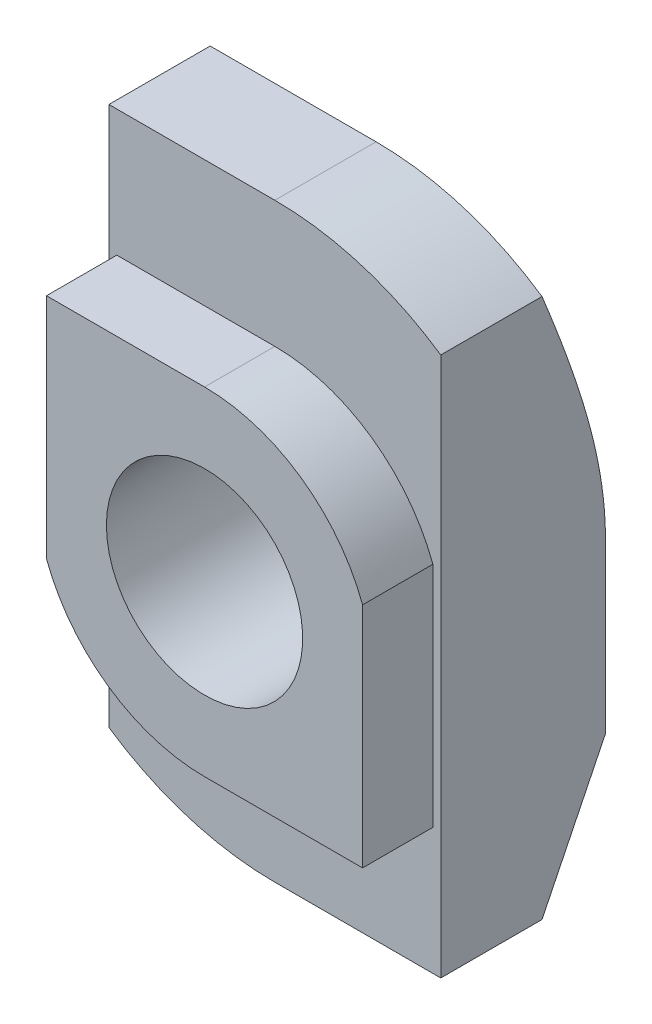
ISO-10303-21;
HEADER;
FILE_DESCRIPTION(('STEP AP214'),'2;1');
FILE_NAME('part.step','',(''),(''),'','','');
FILE_SCHEMA(('AUTOMOTIVE_DESIGN { 1 0 10303 214 1 1 1 1 }'));
ENDSEC;
DATA;
#1=APPLICATION_CONTEXT('core data for automotive mechanical design processes');
#2=APPLICATION_PROTOCOL_DEFINITION('international standard','automotive_design',2000,#1);
#3=PRODUCT_CONTEXT('',#1,'mechanical');
#4=PRODUCT('Part','Part','',(#3));
#5=PRODUCT_RELATED_PRODUCT_CATEGORY('part','',(#4));
#6=PRODUCT_DEFINITION_FORMATION('','',#4);
#7=PRODUCT_DEFINITION_CONTEXT('part definition',#1,'design');
#8=PRODUCT_DEFINITION('design','',#6,#7);
#9=PRODUCT_DEFINITION_SHAPE('','',#8);
#10=(LENGTH_UNIT() NAMED_UNIT(*) SI_UNIT(.MILLI.,.METRE.));
#11=(NAMED_UNIT(*) PLANE_ANGLE_UNIT() SI_UNIT($,.RADIAN.));
#12=(NAMED_UNIT(*) SI_UNIT($,.STERADIAN.) SOLID_ANGLE_UNIT());
#13=UNCERTAINTY_MEASURE_WITH_UNIT(LENGTH_MEASURE(1.E-05),#10,'distance_accuracy_value','');
#14=(GEOMETRIC_REPRESENTATION_CONTEXT(3) GLOBAL_UNCERTAINTY_ASSIGNED_CONTEXT((#13)) GLOBAL_UNIT_ASSIGNED_CONTEXT((#10,
#11,#12)) REPRESENTATION_CONTEXT('',''));
#15=CARTESIAN_POINT('',(0.,0.,0.));
#16=DIRECTION('',(0.,0.,1.));
#17=DIRECTION('',(1.,0.,0.));
#18=AXIS2_PLACEMENT_3D('',#15,#16,#17);
#19=CARTESIAN_POINT('',(-1.405,-0.52533322758036,4.4));
#20=DIRECTION('',(0.,0.,-1.));
#21=DIRECTION('',(-1.,0.,0.));
#22=AXIS2_PLACEMENT_3D('',#19,#20,#21);
#23=CYLINDRICAL_SURFACE('',#22,4.5);
#24=DIRECTION('',(0.,0.,-1.));
#25=VECTOR('',#24,1.);
#26=CARTESIAN_POINT('',(-5.62,-2.10133291032144,4.4));
#27=LINE('',#26,#25);
#28=CARTESIAN_POINT('',(-5.62,-2.10133291032144,4.4));
#29=VERTEX_POINT('',#28);
#30=CARTESIAN_POINT('',(-5.62,-2.10133291032144,2.525));
#31=VERTEX_POINT('',#30);
#32=EDGE_CURVE('E136',#29,#31,#27,.T.);
#33=ORIENTED_EDGE('',*,*,#32,.T.);
#34=CARTESIAN_POINT('',(-1.405,-0.52533322758036,2.525));
#35=DIRECTION('',(0.,0.,-1.));
#36=DIRECTION('',(-1.,0.,0.));
#37=AXIS2_PLACEMENT_3D('',#34,#35,#36);
#38=CIRCLE('',#37,4.5);
#39=CARTESIAN_POINT('',(-1.405,-5.02533322758036,2.525));
#40=VERTEX_POINT('',#39);
#41=EDGE_CURVE('E331',#31,#40,#38,.F.);
#42=ORIENTED_EDGE('',*,*,#41,.T.);
#43=DIRECTION('',(0.,0.,-1.));
#44=VECTOR('',#43,1.);
#45=CARTESIAN_POINT('',(-1.405,-5.02533322758036,4.4));
#46=LINE('',#45,#44);
#47=CARTESIAN_POINT('',(-1.405,-5.02533322758036,4.4));
#48=VERTEX_POINT('',#47);
#49=EDGE_CURVE('E202',#48,#40,#46,.T.);
#50=ORIENTED_EDGE('',*,*,#49,.F.);
#51=CARTESIAN_POINT('',(-1.405,-0.52533322758036,4.4));
#52=DIRECTION('',(0.,0.,1.));
#53=DIRECTION('',(-1.,0.,0.));
#54=AXIS2_PLACEMENT_3D('',#51,#52,#53);
#55=CIRCLE('',#54,4.5);
#56=EDGE_CURVE('E282',#29,#48,#55,.T.);
#57=ORIENTED_EDGE('',*,*,#56,.F.);
#58=EDGE_LOOP('',(#33,#42,#50,#57));
#59=FACE_BOUND('',#58,.T.);
#60=ADVANCED_FACE('F40',(#59),#23,.T.);
#61=CARTESIAN_POINT('',(-1.405,3.97466677241964,4.4));
#62=DIRECTION('',(0.,-1.,0.));
#63=DIRECTION('',(0.,0.,-1.));
#64=AXIS2_PLACEMENT_3D('',#61,#62,#63);
#65=PLANE('',#64);
#66=DIRECTION('',(1.,0.,0.));
#67=VECTOR('',#66,1.);
#68=CARTESIAN_POINT('',(-1.405,3.97466677241964,2.525));
#69=LINE('',#68,#67);
#70=CARTESIAN_POINT('',(-5.62,3.97466677241964,2.525));
#71=VERTEX_POINT('',#70);
#72=CARTESIAN_POINT('',(-1.405,3.97466677241964,2.525));
#73=VERTEX_POINT('',#72);
#74=EDGE_CURVE('E127',#71,#73,#69,.T.);
#75=ORIENTED_EDGE('',*,*,#74,.F.);
#76=DIRECTION('',(0.,0.,1.));
#77=VECTOR('',#76,1.);
#78=CARTESIAN_POINT('',(-5.62,3.97466677241964,4.4));
#79=LINE('',#78,#77);
#80=CARTESIAN_POINT('',(-5.62,3.97466677241964,4.4));
#81=VERTEX_POINT('',#80);
#82=EDGE_CURVE('E210',#71,#81,#79,.T.);
#83=ORIENTED_EDGE('',*,*,#82,.T.);
#84=DIRECTION('',(-1.,0.,0.));
#85=VECTOR('',#84,1.);
#86=CARTESIAN_POINT('',(-1.405,3.97466677241964,4.4));
#87=LINE('',#86,#85);
#88=CARTESIAN_POINT('',(-1.405,3.97466677241964,4.4));
#89=VERTEX_POINT('',#88);
#90=EDGE_CURVE('E248',#89,#81,#87,.T.);
#91=ORIENTED_EDGE('',*,*,#90,.F.);
#92=DIRECTION('',(0.,0.,-1.));
#93=VECTOR('',#92,1.);
#94=CARTESIAN_POINT('',(-1.405,3.97466677241964,4.4));
#95=LINE('',#94,#93);
#96=EDGE_CURVE('E215',#89,#73,#95,.T.);
#97=ORIENTED_EDGE('',*,*,#96,.T.);
#98=EDGE_LOOP('',(#75,#83,#91,#97));
#99=FACE_BOUND('',#98,.T.);
#100=ADVANCED_FACE('F289',(#99),#65,.F.);
#101=CARTESIAN_POINT('',(-1.405,-0.52533322758036,4.4));
#102=DIRECTION('',(0.,0.,-1.));
#103=DIRECTION('',(-1.,0.,0.));
#104=AXIS2_PLACEMENT_3D('',#101,#102,#103);
#105=CYLINDRICAL_SURFACE('',#104,4.5);
#106=DIRECTION('',(0.,0.,-1.));
#107=VECTOR('',#106,1.);
#108=CARTESIAN_POINT('',(2.81,1.05066645516072,4.4));
#109=LINE('',#108,#107);
#110=CARTESIAN_POINT('',(2.81,1.05066645516072,4.4));
#111=VERTEX_POINT('',#110);
#112=CARTESIAN_POINT('',(2.81,1.05066645516072,2.525));
#113=VERTEX_POINT('',#112);
#114=EDGE_CURVE('E208',#111,#113,#109,.T.);
#115=ORIENTED_EDGE('',*,*,#114,.T.);
#116=CARTESIAN_POINT('',(-1.405,-0.52533322758036,2.525));
#117=DIRECTION('',(0.,0.,-1.));
#118=DIRECTION('',(-1.,0.,0.));
#119=AXIS2_PLACEMENT_3D('',#116,#117,#118);
#120=CIRCLE('',#119,4.5);
#121=EDGE_CURVE('E241',#113,#73,#120,.F.);
#122=ORIENTED_EDGE('',*,*,#121,.T.);
#123=ORIENTED_EDGE('',*,*,#96,.F.);
#124=CARTESIAN_POINT('',(-1.405,-0.52533322758036,4.4));
#125=DIRECTION('',(0.,0.,1.));
#126=DIRECTION('',(-1.,0.,0.));
#127=AXIS2_PLACEMENT_3D('',#124,#125,#126);
#128=CIRCLE('',#127,4.5);
#129=EDGE_CURVE('E240',#111,#89,#128,.T.);
#130=ORIENTED_EDGE('',*,*,#129,.F.);
#131=EDGE_LOOP('',(#115,#122,#123,#130));
#132=FACE_BOUND('',#131,.T.);
#133=ADVANCED_FACE('F374',(#132),#105,.T.);
#134=CARTESIAN_POINT('',(-1.405,-5.02533322758036,4.4));
#135=DIRECTION('',(0.,1.,0.));
#136=DIRECTION('',(1.,0.,0.));
#137=AXIS2_PLACEMENT_3D('',#134,#135,#136);
#138=PLANE('',#137);
#139=DIRECTION('',(-1.,0.,0.));
#140=VECTOR('',#139,1.);
#141=CARTESIAN_POINT('',(-1.405,-5.02533322758036,2.525));
#142=LINE('',#141,#140);
#143=CARTESIAN_POINT('',(2.81,-5.02533322758036,2.525));
#144=VERTEX_POINT('',#143);
#145=EDGE_CURVE('E328',#144,#40,#142,.T.);
#146=ORIENTED_EDGE('',*,*,#145,.F.);
#147=DIRECTION('',(0.,0.,1.));
#148=VECTOR('',#147,1.);
#149=CARTESIAN_POINT('',(2.81,-5.02533322758036,4.4));
#150=LINE('',#149,#148);
#151=CARTESIAN_POINT('',(2.81,-5.02533322758036,4.4));
#152=VERTEX_POINT('',#151);
#153=EDGE_CURVE('E182',#144,#152,#150,.T.);
#154=ORIENTED_EDGE('',*,*,#153,.T.);
#155=DIRECTION('',(1.,0.,0.));
#156=VECTOR('',#155,1.);
#157=CARTESIAN_POINT('',(-1.405,-5.02533322758036,4.4));
#158=LINE('',#157,#156);
#159=EDGE_CURVE('E207',#48,#152,#158,.T.);
#160=ORIENTED_EDGE('',*,*,#159,.F.);
#161=ORIENTED_EDGE('',*,*,#49,.T.);
#162=EDGE_LOOP('',(#146,#154,#160,#161));
#163=FACE_BOUND('',#162,.T.);
#164=ADVANCED_FACE('F383',(#163),#138,.F.);
#165=CARTESIAN_POINT('',(-5.83,-8.40033322758036,-2.2));
#166=DIRECTION('',(0.,-1.,0.));
#167=DIRECTION('',(0.,0.,-1.));
#168=AXIS2_PLACEMENT_3D('',#165,#166,#167);
#169=PLANE('',#168);
#170=DIRECTION('',(-1.,0.,0.));
#171=VECTOR('',#170,1.);
#172=CARTESIAN_POINT('',(3.02,-8.40033322758036,2.525));
#173=LINE('',#172,#171);
#174=CARTESIAN_POINT('',(3.02,-8.40033322758036,2.525));
#175=VERTEX_POINT('',#174);
#176=CARTESIAN_POINT('',(-1.405,-8.40033322758036,2.525));
#177=VERTEX_POINT('',#176);
#178=EDGE_CURVE('E309',#175,#177,#173,.T.);
#179=ORIENTED_EDGE('',*,*,#178,.T.);
#180=DIRECTION('',(0.,0.,1.));
#181=VECTOR('',#180,1.);
#182=CARTESIAN_POINT('',(-1.405,-8.40033322758036,1.175));
#183=LINE('',#182,#181);
#184=CARTESIAN_POINT('',(-1.405,-8.40033322758036,-0.175));
#185=VERTEX_POINT('',#184);
#186=EDGE_CURVE('E50',#185,#177,#183,.T.);
#187=ORIENTED_EDGE('',*,*,#186,.F.);
#188=DIRECTION('',(-1.,0.,0.));
#189=VECTOR('',#188,1.);
#190=CARTESIAN_POINT('',(-3.6175,-8.40033322758036,-0.175));
#191=LINE('',#190,#189);
#192=CARTESIAN_POINT('',(3.02,-8.40033322758036,-0.175));
#193=VERTEX_POINT('',#192);
#194=EDGE_CURVE('E11',#193,#185,#191,.T.);
#195=ORIENTED_EDGE('',*,*,#194,.F.);
#196=DIRECTION('',(0.,0.,1.));
#197=VECTOR('',#196,1.);
#198=CARTESIAN_POINT('',(3.02,-8.40033322758036,-2.2));
#199=LINE('',#198,#197);
#200=EDGE_CURVE('E232',#193,#175,#199,.T.);
#201=ORIENTED_EDGE('',*,*,#200,.T.);
#202=EDGE_LOOP('',(#179,#187,#195,#201));
#203=FACE_BOUND('',#202,.T.);
#204=ADVANCED_FACE('F308',(#203),#169,.T.);
#205=CARTESIAN_POINT('',(-3.6175,-6.33783322758036,-1.1875));
#206=DIRECTION('',(0.,-0.440673190639415,-0.89766761056177));
#207=DIRECTION('',(0.,-0.89766761056177,0.440673190639415));
#208=AXIS2_PLACEMENT_3D('',#205,#206,#207);
#209=PLANE('',#208);
#210=DIRECTION('',(0.668005245131528,-0.668005245131529,0.327929847610023));
#211=VECTOR('',#210,1.);
#212=CARTESIAN_POINT('',(0.93596197816787,-2.86629520574823,-2.89170957435395));
#213=LINE('',#212,#211);
#214=CARTESIAN_POINT('',(2.34500000252043,-4.27533323012221,-2.19999999939639));
#215=VERTEX_POINT('',#214);
#216=CARTESIAN_POINT('',(3.02,-4.95033322758036,-1.86863636363636));
#217=VERTEX_POINT('',#216);
#218=EDGE_CURVE('E211',#215,#217,#213,.T.);
#219=ORIENTED_EDGE('',*,*,#218,.T.);
#220=DIRECTION('',(0.,-0.89766761056177,0.440673190639415));
#221=VECTOR('',#220,1.);
#222=CARTESIAN_POINT('',(3.02,-6.96856045187445,-0.877870271710176));
#223=LINE('',#222,#221);
#224=EDGE_CURVE('E226',#217,#193,#223,.T.);
#225=ORIENTED_EDGE('',*,*,#224,.T.);
#226=ORIENTED_EDGE('',*,*,#194,.T.);
#227=DIRECTION('',(0.,-0.89766761056177,0.440673190639415));
#228=VECTOR('',#227,1.);
#229=CARTESIAN_POINT('',(-1.405,-6.33783324216942,-1.18749999283809));
#230=LINE('',#229,#228);
#231=CARTESIAN_POINT('',(-1.405,-4.27533322822308,-2.19999999968448));
#232=VERTEX_POINT('',#231);
#233=EDGE_CURVE('E171',#232,#185,#230,.T.);
#234=ORIENTED_EDGE('',*,*,#233,.F.);
#235=DIRECTION('',(1.,0.,0.));
#236=VECTOR('',#235,1.);
#237=CARTESIAN_POINT('',(-3.6175,-4.27533322758036,-2.2));
#238=LINE('',#237,#236);
#239=EDGE_CURVE('E206',#232,#215,#238,.T.);
#240=ORIENTED_EDGE('',*,*,#239,.T.);
#241=EDGE_LOOP('',(#219,#225,#226,#234,#240));
#242=FACE_BOUND('',#241,.T.);
#243=ADVANCED_FACE('F343',(#242),#209,.T.);
#244=CARTESIAN_POINT('',(0.8075,5.28716677241964,-1.1875));
#245=DIRECTION('',(0.,0.440673190639415,-0.89766761056177));
#246=DIRECTION('',(-1.,0.,0.));
#247=AXIS2_PLACEMENT_3D('',#244,#245,#246);
#248=PLANE('',#247);
#249=DIRECTION('',(-0.668005245131529,0.668005245131529,0.327929847610023));
#250=VECTOR('',#249,1.);
#251=CARTESIAN_POINT('',(-3.74596197816787,1.81562875058751,-2.89170957435395));
#252=LINE('',#251,#250);
#253=CARTESIAN_POINT('',(-5.15500000252043,3.22466677496149,-2.19999999939639));
#254=VERTEX_POINT('',#253);
#255=CARTESIAN_POINT('',(-5.83,3.89966677241964,-1.86863636363636));
#256=VERTEX_POINT('',#255);
#257=EDGE_CURVE('E225',#254,#256,#252,.T.);
#258=ORIENTED_EDGE('',*,*,#257,.T.);
#259=DIRECTION('',(0.,0.89766761056177,0.440673190639415));
#260=VECTOR('',#259,1.);
#261=CARTESIAN_POINT('',(-5.83,5.91789399671373,-0.877870271710176));
#262=LINE('',#261,#260);
#263=CARTESIAN_POINT('',(-5.83,7.34966677241964,-0.175));
#264=VERTEX_POINT('',#263);
#265=EDGE_CURVE('E188',#256,#264,#262,.T.);
#266=ORIENTED_EDGE('',*,*,#265,.T.);
#267=DIRECTION('',(1.,0.,0.));
#268=VECTOR('',#267,1.);
#269=CARTESIAN_POINT('',(0.8075,7.34966677241964,-0.175));
#270=LINE('',#269,#268);
#271=CARTESIAN_POINT('',(-1.405,7.34966677241964,-0.175));
#272=VERTEX_POINT('',#271);
#273=EDGE_CURVE('E185',#264,#272,#270,.T.);
#274=ORIENTED_EDGE('',*,*,#273,.T.);
#275=DIRECTION('',(0.,0.89766761056177,0.440673190639415));
#276=VECTOR('',#275,1.);
#277=CARTESIAN_POINT('',(-1.405,5.2871667870087,-1.18749999283809));
#278=LINE('',#277,#276);
#279=CARTESIAN_POINT('',(-1.405,3.22466677306236,-2.19999999968448));
#280=VERTEX_POINT('',#279);
#281=EDGE_CURVE('E160',#280,#272,#278,.T.);
#282=ORIENTED_EDGE('',*,*,#281,.F.);
#283=DIRECTION('',(-1.,0.,0.));
#284=VECTOR('',#283,1.);
#285=CARTESIAN_POINT('',(0.8075,3.22466677241964,-2.2));
#286=LINE('',#285,#284);
#287=EDGE_CURVE('E245',#280,#254,#286,.T.);
#288=ORIENTED_EDGE('',*,*,#287,.T.);
#289=EDGE_LOOP('',(#258,#266,#274,#282,#288));
#290=FACE_BOUND('',#289,.T.);
#291=ADVANCED_FACE('F186',(#290),#248,.T.);
#292=CARTESIAN_POINT('',(-1.405,-0.52533322758036,1.175));
#293=DIRECTION('',(0.,0.,-1.));
#294=DIRECTION('',(0.,-1.,0.));
#295=AXIS2_PLACEMENT_3D('',#292,#293,#294);
#296=CYLINDRICAL_SURFACE('',#295,7.875);
#297=CARTESIAN_POINT('',(-1.405,-0.525333227580361,2.525));
#298=DIRECTION('',(0.,0.,-1.));
#299=DIRECTION('',(-1.,0.,0.));
#300=AXIS2_PLACEMENT_3D('',#297,#298,#299);
#301=CIRCLE('',#300,7.875);
#302=CARTESIAN_POINT('',(-5.83,-7.0395484527629,2.525));
#303=VERTEX_POINT('',#302);
#304=EDGE_CURVE('E318',#177,#303,#301,.T.);
#305=ORIENTED_EDGE('',*,*,#304,.T.);
#306=DIRECTION('',(0.,0.,1.));
#307=VECTOR('',#306,1.);
#308=CARTESIAN_POINT('',(-5.83,-7.0395484527629,1.175));
#309=LINE('',#308,#307);
#310=CARTESIAN_POINT('',(-5.83,-7.0395484527629,-0.175));
#311=VERTEX_POINT('',#310);
#312=EDGE_CURVE('E196',#311,#303,#309,.T.);
#313=ORIENTED_EDGE('',*,*,#312,.F.);
#314=CARTESIAN_POINT('',(-1.405,-0.525333227580361,-0.175));
#315=DIRECTION('',(0.,0.,-1.));
#316=DIRECTION('',(0.,-1.,0.));
#317=AXIS2_PLACEMENT_3D('',#314,#315,#316);
#318=CIRCLE('',#317,7.875);
#319=EDGE_CURVE('E253',#185,#311,#318,.T.);
#320=ORIENTED_EDGE('',*,*,#319,.F.);
#321=ORIENTED_EDGE('',*,*,#186,.T.);
#322=EDGE_LOOP('',(#305,#313,#320,#321));
#323=FACE_BOUND('',#322,.T.);
#324=ADVANCED_FACE('F357',(#323),#296,.T.);
#325=CARTESIAN_POINT('',(-1.405,-0.52533322758036,-1.18749999283809));
#326=DIRECTION('',(0.,0.,1.));
#327=DIRECTION('',(0.,-1.,0.));
#328=AXIS2_PLACEMENT_3D('',#325,#326,#327);
#329=CONICAL_SURFACE('',#328,5.81250001458906,1.11444785823779);
#330=CARTESIAN_POINT('',(-5.83,-0.52533322758036,-1.86863636363636));
#331=CARTESIAN_POINT('',(-5.83,-2.86886187566433,-1.86863636363636));
#332=CARTESIAN_POINT('',(-5.83,-7.0395484527629,-0.175));
#333=(BOUNDED_CURVE() B_SPLINE_CURVE(2,(#330,#331,#332),.UNSPECIFIED.,.F.,
.F.) B_SPLINE_CURVE_WITH_KNOTS((3,3),(0.448718690060841,0.897437380121683),
.UNSPECIFIED.) CURVE() GEOMETRIC_REPRESENTATION_ITEM() RATIONAL_B_SPLINE_CURVE((1.38983050847458,
1.38983050847458,1.)) REPRESENTATION_ITEM(''));
#334=CARTESIAN_POINT('',(-5.83,-0.52533322758036,-1.86863636363636));
#335=VERTEX_POINT('',#334);
#336=EDGE_CURVE('E198',#335,#311,#333,.T.);
#337=ORIENTED_EDGE('',*,*,#336,.F.);
#338=DIRECTION('',(0.89766761056177,0.,-0.440673190639415));
#339=VECTOR('',#338,1.);
#340=CARTESIAN_POINT('',(-9.28,-0.52533322758036,-0.175));
#341=LINE('',#340,#339);
#342=CARTESIAN_POINT('',(-5.15500000064272,-0.52533322758036,-2.19999999968448));
#343=VERTEX_POINT('',#342);
#344=EDGE_CURVE('E172',#335,#343,#341,.T.);
#345=ORIENTED_EDGE('',*,*,#344,.T.);
#346=CARTESIAN_POINT('',(-1.405,-0.52533322758036,-2.2));
#347=DIRECTION('',(0.,0.,-1.));
#348=DIRECTION('',(0.,-1.,0.));
#349=AXIS2_PLACEMENT_3D('',#346,#347,#348);
#350=CIRCLE('',#349,3.75);
#351=EDGE_CURVE('E246',#232,#343,#350,.T.);
#352=ORIENTED_EDGE('',*,*,#351,.F.);
#353=ORIENTED_EDGE('',*,*,#233,.T.);
#354=ORIENTED_EDGE('',*,*,#319,.T.);
#355=EDGE_LOOP('',(#337,#345,#352,#353,#354));
#356=FACE_BOUND('',#355,.T.);
#357=ADVANCED_FACE('F348',(#356),#329,.T.);
#358=CARTESIAN_POINT('',(-1.405,-0.52533322758036,-1.18749999283809));
#359=DIRECTION('',(0.,0.,1.));
#360=DIRECTION('',(0.,1.,0.));
#361=AXIS2_PLACEMENT_3D('',#358,#359,#360);
#362=CONICAL_SURFACE('',#361,5.81250001458906,1.11444785823779);
#363=CARTESIAN_POINT('',(3.02,-0.525333227580361,-1.86863636363636));
#364=CARTESIAN_POINT('',(3.02,1.81819542050359,-1.86863636363636));
#365=CARTESIAN_POINT('',(3.02,5.98888199760218,-0.175));
#366=(BOUNDED_CURVE() B_SPLINE_CURVE(2,(#363,#364,#365),.UNSPECIFIED.,.F.,
.F.) B_SPLINE_CURVE_WITH_KNOTS((3,3),(0.448718690060842,0.897437380121683),
.UNSPECIFIED.) CURVE() GEOMETRIC_REPRESENTATION_ITEM() RATIONAL_B_SPLINE_CURVE((1.38983050847458,
1.38983050847458,1.)) REPRESENTATION_ITEM(''));
#367=CARTESIAN_POINT('',(3.02,-0.525333227580361,-1.86863636363636));
#368=VERTEX_POINT('',#367);
#369=CARTESIAN_POINT('',(3.02,5.98888199760218,-0.175));
#370=VERTEX_POINT('',#369);
#371=EDGE_CURVE('E221',#368,#370,#366,.T.);
#372=ORIENTED_EDGE('',*,*,#371,.F.);
#373=DIRECTION('',(-0.89766761056177,0.,-0.440673190639415));
#374=VECTOR('',#373,1.);
#375=CARTESIAN_POINT('',(6.47,-0.525333227580361,-0.175));
#376=LINE('',#375,#374);
#377=CARTESIAN_POINT('',(2.34500000064272,-0.525333227580361,-2.19999999968448));
#378=VERTEX_POINT('',#377);
#379=EDGE_CURVE('E214',#368,#378,#376,.T.);
#380=ORIENTED_EDGE('',*,*,#379,.T.);
#381=CARTESIAN_POINT('',(-1.405,-0.52533322758036,-2.2));
#382=DIRECTION('',(0.,0.,-1.));
#383=DIRECTION('',(0.,1.,0.));
#384=AXIS2_PLACEMENT_3D('',#381,#382,#383);
#385=CIRCLE('',#384,3.75);
#386=EDGE_CURVE('E166',#280,#378,#385,.T.);
#387=ORIENTED_EDGE('',*,*,#386,.F.);
#388=ORIENTED_EDGE('',*,*,#281,.T.);
#389=CARTESIAN_POINT('',(-1.405,-0.525333227580361,-0.175));
#390=DIRECTION('',(0.,0.,-1.));
#391=DIRECTION('',(0.,1.,0.));
#392=AXIS2_PLACEMENT_3D('',#389,#390,#391);
#393=CIRCLE('',#392,7.875);
#394=EDGE_CURVE('E163',#272,#370,#393,.T.);
#395=ORIENTED_EDGE('',*,*,#394,.T.);
#396=EDGE_LOOP('',(#372,#380,#387,#388,#395));
#397=FACE_BOUND('',#396,.T.);
#398=ADVANCED_FACE('F162',(#397),#362,.T.);
#399=CARTESIAN_POINT('',(-5.83,-0.52533322758036,-1.86863636363636));
#400=DIRECTION('',(0.440673190639415,0.,0.89766761056177));
#401=DIRECTION('',(0.,-1.,0.));
#402=AXIS2_PLACEMENT_3D('',#399,#400,#401);
#403=PLANE('',#402);
#404=ORIENTED_EDGE('',*,*,#257,.F.);
#405=DIRECTION('',(0.,1.,0.));
#406=VECTOR('',#405,1.);
#407=CARTESIAN_POINT('',(-5.155,-0.52533322758036,-2.2));
#408=LINE('',#407,#406);
#409=EDGE_CURVE('E242',#343,#254,#408,.T.);
#410=ORIENTED_EDGE('',*,*,#409,.F.);
#411=ORIENTED_EDGE('',*,*,#344,.F.);
#412=DIRECTION('',(0.,-1.,0.));
#413=VECTOR('',#412,1.);
#414=CARTESIAN_POINT('',(-5.83,3.41216677241964,-1.86863636363636));
#415=LINE('',#414,#413);
#416=EDGE_CURVE('E44',#256,#335,#415,.T.);
#417=ORIENTED_EDGE('',*,*,#416,.F.);
#418=EDGE_LOOP('',(#404,#410,#411,#417));
#419=FACE_BOUND('',#418,.T.);
#420=ADVANCED_FACE('F352',(#419),#403,.F.);
#421=CARTESIAN_POINT('',(3.02,-8.40033322758036,-2.2));
#422=DIRECTION('',(1.,0.,0.));
#423=DIRECTION('',(0.,1.,0.));
#424=AXIS2_PLACEMENT_3D('',#421,#422,#423);
#425=PLANE('',#424);
#426=DIRECTION('',(0.,0.,1.));
#427=VECTOR('',#426,1.);
#428=CARTESIAN_POINT('',(3.02,5.98888199760218,1.175));
#429=LINE('',#428,#427);
#430=CARTESIAN_POINT('',(3.02,5.98888199760218,2.525));
#431=VERTEX_POINT('',#430);
#432=EDGE_CURVE('E181',#370,#431,#429,.T.);
#433=ORIENTED_EDGE('',*,*,#432,.T.);
#434=DIRECTION('',(0.,-1.,0.));
#435=VECTOR('',#434,1.);
#436=CARTESIAN_POINT('',(3.02,-5.19383330689509,2.525));
#437=LINE('',#436,#435);
#438=EDGE_CURVE('E234',#431,#175,#437,.T.);
#439=ORIENTED_EDGE('',*,*,#438,.T.);
#440=ORIENTED_EDGE('',*,*,#200,.F.);
#441=ORIENTED_EDGE('',*,*,#224,.F.);
#442=DIRECTION('',(0.,1.,0.));
#443=VECTOR('',#442,1.);
#444=CARTESIAN_POINT('',(3.02,-4.46283322758036,-1.86863636363636));
#445=LINE('',#444,#443);
#446=EDGE_CURVE('E273',#217,#368,#445,.T.);
#447=ORIENTED_EDGE('',*,*,#446,.T.);
#448=ORIENTED_EDGE('',*,*,#371,.T.);
#449=EDGE_LOOP('',(#433,#439,#440,#441,#447,#448));
#450=FACE_BOUND('',#449,.T.);
#451=ADVANCED_FACE('F321',(#450),#425,.T.);
#452=CARTESIAN_POINT('',(3.02,-0.525333227580361,-1.86863636363636));
#453=DIRECTION('',(-0.440673190639415,0.,0.89766761056177));
#454=DIRECTION('',(0.,1.,0.));
#455=AXIS2_PLACEMENT_3D('',#452,#453,#454);
#456=PLANE('',#455);
#457=ORIENTED_EDGE('',*,*,#218,.F.);
#458=DIRECTION('',(0.,-1.,0.));
#459=VECTOR('',#458,1.);
#460=CARTESIAN_POINT('',(2.345,-0.525333227580361,-2.2));
#461=LINE('',#460,#459);
#462=EDGE_CURVE('E203',#378,#215,#461,.T.);
#463=ORIENTED_EDGE('',*,*,#462,.F.);
#464=ORIENTED_EDGE('',*,*,#379,.F.);
#465=ORIENTED_EDGE('',*,*,#446,.F.);
#466=EDGE_LOOP('',(#457,#463,#464,#465));
#467=FACE_BOUND('',#466,.T.);
#468=ADVANCED_FACE('F341',(#467),#456,.F.);
#469=CARTESIAN_POINT('',(-5.62,3.97466677241964,4.4));
#470=DIRECTION('',(1.,0.,0.));
#471=DIRECTION('',(0.,1.,0.));
#472=AXIS2_PLACEMENT_3D('',#469,#470,#471);
#473=PLANE('',#472);
#474=DIRECTION('',(0.,-1.,0.));
#475=VECTOR('',#474,1.);
#476=CARTESIAN_POINT('',(-5.62,1.72466677241964,4.4));
#477=LINE('',#476,#475);
#478=EDGE_CURVE('E251',#81,#29,#477,.T.);
#479=ORIENTED_EDGE('',*,*,#478,.F.);
#480=ORIENTED_EDGE('',*,*,#82,.F.);
#481=DIRECTION('',(0.,-1.,0.));
#482=VECTOR('',#481,1.);
#483=CARTESIAN_POINT('',(-5.62,-5.02533322758036,2.525));
#484=LINE('',#483,#482);
#485=EDGE_CURVE('E220',#71,#31,#484,.T.);
#486=ORIENTED_EDGE('',*,*,#485,.T.);
#487=ORIENTED_EDGE('',*,*,#32,.F.);
#488=EDGE_LOOP('',(#479,#480,#486,#487));
#489=FACE_BOUND('',#488,.T.);
#490=ADVANCED_FACE('F293',(#489),#473,.F.);
#491=CARTESIAN_POINT('',(2.81,-5.02533322758036,4.4));
#492=DIRECTION('',(-1.,0.,0.));
#493=DIRECTION('',(0.,0.,1.));
#494=AXIS2_PLACEMENT_3D('',#491,#492,#493);
#495=PLANE('',#494);
#496=DIRECTION('',(0.,1.,0.));
#497=VECTOR('',#496,1.);
#498=CARTESIAN_POINT('',(2.81,-2.77533322758036,4.4));
#499=LINE('',#498,#497);
#500=EDGE_CURVE('E237',#152,#111,#499,.T.);
#501=ORIENTED_EDGE('',*,*,#500,.F.);
#502=ORIENTED_EDGE('',*,*,#153,.F.);
#503=DIRECTION('',(0.,1.,0.));
#504=VECTOR('',#503,1.);
#505=CARTESIAN_POINT('',(2.81,3.97466677241964,2.525));
#506=LINE('',#505,#504);
#507=EDGE_CURVE('E219',#144,#113,#506,.T.);
#508=ORIENTED_EDGE('',*,*,#507,.T.);
#509=ORIENTED_EDGE('',*,*,#114,.F.);
#510=EDGE_LOOP('',(#501,#502,#508,#509));
#511=FACE_BOUND('',#510,.T.);
#512=ADVANCED_FACE('F42',(#511),#495,.F.);
#513=CARTESIAN_POINT('',(-1.405,-0.52533322758036,1.175));
#514=DIRECTION('',(0.,0.,-1.));
#515=DIRECTION('',(0.,1.,0.));
#516=AXIS2_PLACEMENT_3D('',#513,#514,#515);
#517=CYLINDRICAL_SURFACE('',#516,7.875);
#518=CARTESIAN_POINT('',(-1.405,-0.525333227580361,2.525));
#519=DIRECTION('',(0.,0.,-1.));
#520=DIRECTION('',(-1.,0.,0.));
#521=AXIS2_PLACEMENT_3D('',#518,#519,#520);
#522=CIRCLE('',#521,7.875);
#523=CARTESIAN_POINT('',(-1.405,7.34966677241964,2.525));
#524=VERTEX_POINT('',#523);
#525=EDGE_CURVE('E319',#524,#431,#522,.T.);
#526=ORIENTED_EDGE('',*,*,#525,.T.);
#527=ORIENTED_EDGE('',*,*,#432,.F.);
#528=ORIENTED_EDGE('',*,*,#394,.F.);
#529=DIRECTION('',(0.,0.,1.));
#530=VECTOR('',#529,1.);
#531=CARTESIAN_POINT('',(-1.405,7.34966677241964,1.175));
#532=LINE('',#531,#530);
#533=EDGE_CURVE('E178',#272,#524,#532,.T.);
#534=ORIENTED_EDGE('',*,*,#533,.T.);
#535=EDGE_LOOP('',(#526,#527,#528,#534));
#536=FACE_BOUND('',#535,.T.);
#537=ADVANCED_FACE('F176',(#536),#517,.T.);
#538=CARTESIAN_POINT('',(3.02,7.34966677241964,-2.2));
#539=DIRECTION('',(0.,1.,0.));
#540=DIRECTION('',(1.,0.,0.));
#541=AXIS2_PLACEMENT_3D('',#538,#539,#540);
#542=PLANE('',#541);
#543=DIRECTION('',(1.,0.,0.));
#544=VECTOR('',#543,1.);
#545=CARTESIAN_POINT('',(-5.83,7.34966677241964,2.525));
#546=LINE('',#545,#544);
#547=CARTESIAN_POINT('',(-5.83,7.34966677241964,2.525));
#548=VERTEX_POINT('',#547);
#549=EDGE_CURVE('E194',#548,#524,#546,.T.);
#550=ORIENTED_EDGE('',*,*,#549,.T.);
#551=ORIENTED_EDGE('',*,*,#533,.F.);
#552=ORIENTED_EDGE('',*,*,#273,.F.);
#553=DIRECTION('',(0.,0.,1.));
#554=VECTOR('',#553,1.);
#555=CARTESIAN_POINT('',(-5.83,7.34966677241964,-2.2));
#556=LINE('',#555,#554);
#557=EDGE_CURVE('E265',#264,#548,#556,.T.);
#558=ORIENTED_EDGE('',*,*,#557,.T.);
#559=EDGE_LOOP('',(#550,#551,#552,#558));
#560=FACE_BOUND('',#559,.T.);
#561=ADVANCED_FACE('F192',(#560),#542,.T.);
#562=CARTESIAN_POINT('',(-5.83,7.34966677241964,-2.2));
#563=DIRECTION('',(-1.,0.,0.));
#564=DIRECTION('',(0.,0.,1.));
#565=AXIS2_PLACEMENT_3D('',#562,#563,#564);
#566=PLANE('',#565);
#567=ORIENTED_EDGE('',*,*,#312,.T.);
#568=DIRECTION('',(0.,1.,0.));
#569=VECTOR('',#568,1.);
#570=CARTESIAN_POINT('',(-5.83,4.14316685173437,2.525));
#571=LINE('',#570,#569);
#572=EDGE_CURVE('E216',#303,#548,#571,.T.);
#573=ORIENTED_EDGE('',*,*,#572,.T.);
#574=ORIENTED_EDGE('',*,*,#557,.F.);
#575=ORIENTED_EDGE('',*,*,#265,.F.);
#576=ORIENTED_EDGE('',*,*,#416,.T.);
#577=ORIENTED_EDGE('',*,*,#336,.T.);
#578=EDGE_LOOP('',(#567,#573,#574,#575,#576,#577));
#579=FACE_BOUND('',#578,.T.);
#580=ADVANCED_FACE('F354',(#579),#566,.T.);
#581=CARTESIAN_POINT('',(-1.405,-0.52533322758036,2.525));
#582=DIRECTION('',(0.,0.,1.));
#583=DIRECTION('',(1.,0.,0.));
#584=AXIS2_PLACEMENT_3D('',#581,#582,#583);
#585=PLANE('',#584);
#586=ORIENTED_EDGE('',*,*,#549,.F.);
#587=ORIENTED_EDGE('',*,*,#572,.F.);
#588=ORIENTED_EDGE('',*,*,#304,.F.);
#589=ORIENTED_EDGE('',*,*,#178,.F.);
#590=ORIENTED_EDGE('',*,*,#438,.F.);
#591=ORIENTED_EDGE('',*,*,#525,.F.);
#592=EDGE_LOOP('',(#586,#587,#588,#589,#590,#591));
#593=FACE_BOUND('',#592,.T.);
#594=ORIENTED_EDGE('',*,*,#485,.F.);
#595=ORIENTED_EDGE('',*,*,#74,.T.);
#596=ORIENTED_EDGE('',*,*,#121,.F.);
#597=ORIENTED_EDGE('',*,*,#507,.F.);
#598=ORIENTED_EDGE('',*,*,#145,.T.);
#599=ORIENTED_EDGE('',*,*,#41,.F.);
#600=EDGE_LOOP('',(#594,#595,#596,#597,#598,#599));
#601=FACE_BOUND('',#600,.T.);
#602=ADVANCED_FACE('F314',(#593,#601),#585,.T.);
#603=CARTESIAN_POINT('',(-1.405,-0.52533322758036,-2.2));
#604=DIRECTION('',(0.,0.,1.));
#605=DIRECTION('',(1.,0.,0.));
#606=AXIS2_PLACEMENT_3D('',#603,#604,#605);
#607=PLANE('',#606);
#608=CARTESIAN_POINT('',(-1.405,-0.52533322758036,-2.2));
#609=DIRECTION('',(0.,0.,-1.));
#610=DIRECTION('',(-1.,0.,0.));
#611=AXIS2_PLACEMENT_3D('',#608,#609,#610);
#612=CIRCLE('',#611,2.617);
#613=CARTESIAN_POINT('',(-4.022,-0.52533322758036,-2.2));
#614=VERTEX_POINT('',#613);
#615=EDGE_CURVE('E615',#614,#614,#612,.T.);
#616=ORIENTED_EDGE('',*,*,#615,.F.);
#617=EDGE_LOOP('',(#616));
#618=FACE_BOUND('',#617,.T.);
#619=ORIENTED_EDGE('',*,*,#462,.T.);
#620=ORIENTED_EDGE('',*,*,#239,.F.);
#621=ORIENTED_EDGE('',*,*,#351,.T.);
#622=ORIENTED_EDGE('',*,*,#409,.T.);
#623=ORIENTED_EDGE('',*,*,#287,.F.);
#624=ORIENTED_EDGE('',*,*,#386,.T.);
#625=EDGE_LOOP('',(#619,#620,#621,#622,#623,#624));
#626=FACE_BOUND('',#625,.T.);
#627=ADVANCED_FACE('F337',(#618,#626),#607,.F.);
#628=CARTESIAN_POINT('',(-1.405,-0.52533322758036,4.4));
#629=DIRECTION('',(0.,0.,1.));
#630=DIRECTION('',(1.,0.,0.));
#631=AXIS2_PLACEMENT_3D('',#628,#629,#630);
#632=PLANE('',#631);
#633=CARTESIAN_POINT('',(-1.405,-0.52533322758036,4.4));
#634=DIRECTION('',(0.,0.,-1.));
#635=DIRECTION('',(-1.,0.,0.));
#636=AXIS2_PLACEMENT_3D('',#633,#634,#635);
#637=CIRCLE('',#636,2.617);
#638=CARTESIAN_POINT('',(-4.022,-0.52533322758036,4.4));
#639=VERTEX_POINT('',#638);
#640=EDGE_CURVE('E323',#639,#639,#637,.T.);
#641=ORIENTED_EDGE('',*,*,#640,.T.);
#642=EDGE_LOOP('',(#641));
#643=FACE_BOUND('',#642,.T.);
#644=ORIENTED_EDGE('',*,*,#500,.T.);
#645=ORIENTED_EDGE('',*,*,#129,.T.);
#646=ORIENTED_EDGE('',*,*,#90,.T.);
#647=ORIENTED_EDGE('',*,*,#478,.T.);
#648=ORIENTED_EDGE('',*,*,#56,.T.);
#649=ORIENTED_EDGE('',*,*,#159,.T.);
#650=EDGE_LOOP('',(#644,#645,#646,#647,#648,#649));
#651=FACE_BOUND('',#650,.T.);
#652=ADVANCED_FACE('F296',(#643,#651),#632,.T.);
#653=CARTESIAN_POINT('',(-1.405,-0.52533322758036,4.4));
#654=DIRECTION('',(0.,0.,-1.));
#655=DIRECTION('',(-1.,0.,0.));
#656=AXIS2_PLACEMENT_3D('',#653,#654,#655);
#657=CYLINDRICAL_SURFACE('',#656,2.617);
#658=ORIENTED_EDGE('',*,*,#640,.F.);
#659=EDGE_LOOP('',(#658));
#660=FACE_BOUND('',#659,.T.);
#661=ORIENTED_EDGE('',*,*,#615,.T.);
#662=EDGE_LOOP('',(#661));
#663=FACE_BOUND('',#662,.T.);
#664=ADVANCED_FACE('F418',(#660,#663),#657,.F.);
#665=CLOSED_SHELL('',(#60,#100,#133,#164,#204,#243,#291,#324,#357,#398,#420,#451,#468,#490,#512,
#537,#561,#580,#602,#627,#652,#664));
#666=MANIFOLD_SOLID_BREP('B2',#665);
#667=ADVANCED_BREP_SHAPE_REPRESENTATION('',(#18,#666),#14);
#668=SHAPE_DEFINITION_REPRESENTATION(#9,#667);
ENDSEC;
END-ISO-10303-21;
